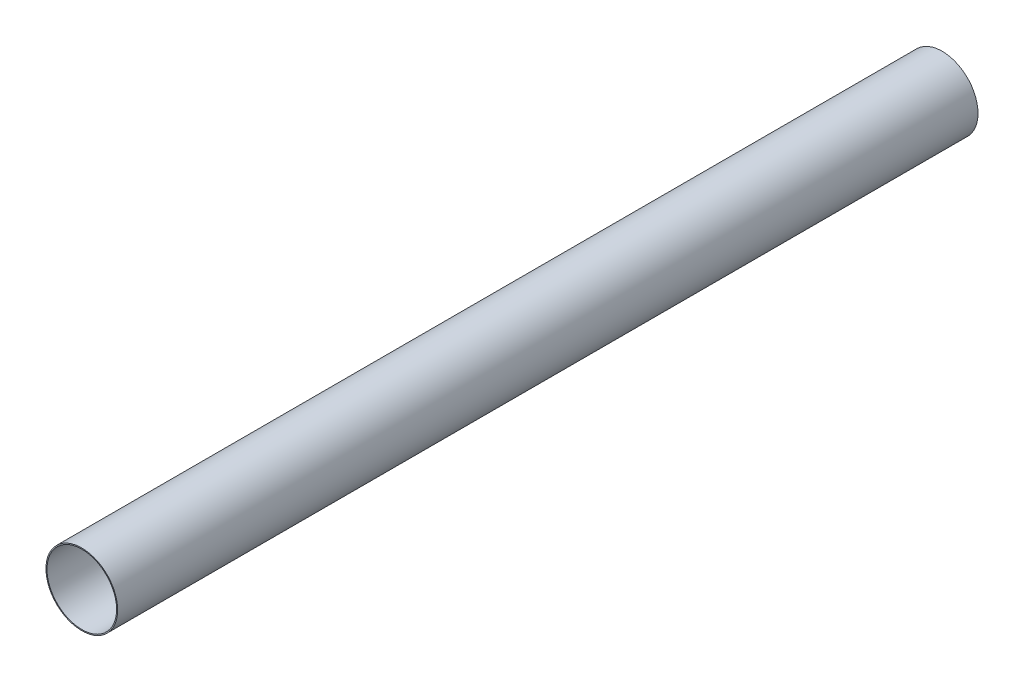
ISO-10303-21;
HEADER;
FILE_DESCRIPTION(('STEP AP214'),'2;1');
FILE_NAME('part.step','',(''),(''),'','','');
FILE_SCHEMA(('AUTOMOTIVE_DESIGN { 1 0 10303 214 1 1 1 1 }'));
ENDSEC;
DATA;
#1=APPLICATION_CONTEXT('core data for automotive mechanical design processes');
#2=APPLICATION_PROTOCOL_DEFINITION('international standard','automotive_design',2000,#1);
#3=PRODUCT_CONTEXT('',#1,'mechanical');
#4=PRODUCT('Part','Part','',(#3));
#5=PRODUCT_RELATED_PRODUCT_CATEGORY('part','',(#4));
#6=PRODUCT_DEFINITION_FORMATION('','',#4);
#7=PRODUCT_DEFINITION_CONTEXT('part definition',#1,'design');
#8=PRODUCT_DEFINITION('design','',#6,#7);
#9=PRODUCT_DEFINITION_SHAPE('','',#8);
#10=(LENGTH_UNIT() NAMED_UNIT(*) SI_UNIT(.MILLI.,.METRE.));
#11=(NAMED_UNIT(*) PLANE_ANGLE_UNIT() SI_UNIT($,.RADIAN.));
#12=(NAMED_UNIT(*) SI_UNIT($,.STERADIAN.) SOLID_ANGLE_UNIT());
#13=UNCERTAINTY_MEASURE_WITH_UNIT(LENGTH_MEASURE(1.E-05),#10,'distance_accuracy_value','');
#14=(GEOMETRIC_REPRESENTATION_CONTEXT(3) GLOBAL_UNCERTAINTY_ASSIGNED_CONTEXT((#13)) GLOBAL_UNIT_ASSIGNED_CONTEXT((#10,
#11,#12)) REPRESENTATION_CONTEXT('',''));
#15=CARTESIAN_POINT('',(0.,0.,0.));
#16=DIRECTION('',(0.,0.,1.));
#17=DIRECTION('',(1.,0.,0.));
#18=AXIS2_PLACEMENT_3D('',#15,#16,#17);
#19=CARTESIAN_POINT('',(0.,0.,1676.4));
#20=DIRECTION('',(0.,0.,1.));
#21=DIRECTION('',(1.,0.,0.));
#22=AXIS2_PLACEMENT_3D('',#19,#20,#21);
#23=PLANE('',#22);
#24=CARTESIAN_POINT('',(0.,0.,1676.4));
#25=DIRECTION('',(0.,0.,1.));
#26=DIRECTION('',(1.,0.,0.));
#27=AXIS2_PLACEMENT_3D('',#24,#25,#26);
#28=CIRCLE('',#27,69.85);
#29=CARTESIAN_POINT('',(69.85,0.,1676.4));
#30=VERTEX_POINT('',#29);
#31=EDGE_CURVE('E10',#30,#30,#28,.T.);
#32=ORIENTED_EDGE('',*,*,#31,.T.);
#33=EDGE_LOOP('',(#32));
#34=FACE_BOUND('',#33,.T.);
#35=CARTESIAN_POINT('',(0.,0.,1676.4));
#36=DIRECTION('',(0.,0.,1.));
#37=DIRECTION('',(1.,0.,0.));
#38=AXIS2_PLACEMENT_3D('',#35,#36,#37);
#39=CIRCLE('',#38,67.85);
#40=CARTESIAN_POINT('',(67.85,0.,1676.4));
#41=VERTEX_POINT('',#40);
#42=EDGE_CURVE('E46',#41,#41,#39,.T.);
#43=ORIENTED_EDGE('',*,*,#42,.F.);
#44=EDGE_LOOP('',(#43));
#45=FACE_BOUND('',#44,.T.);
#46=ADVANCED_FACE('F35',(#34,#45),#23,.T.);
#47=CARTESIAN_POINT('',(0.,0.,0.));
#48=DIRECTION('',(0.,0.,1.));
#49=DIRECTION('',(1.,0.,0.));
#50=AXIS2_PLACEMENT_3D('',#47,#48,#49);
#51=PLANE('',#50);
#52=CARTESIAN_POINT('',(0.,0.,0.));
#53=DIRECTION('',(0.,0.,1.));
#54=DIRECTION('',(1.,0.,0.));
#55=AXIS2_PLACEMENT_3D('',#52,#53,#54);
#56=CIRCLE('',#55,69.85);
#57=CARTESIAN_POINT('',(69.85,0.,0.));
#58=VERTEX_POINT('',#57);
#59=EDGE_CURVE('E39',#58,#58,#56,.T.);
#60=ORIENTED_EDGE('',*,*,#59,.F.);
#61=EDGE_LOOP('',(#60));
#62=FACE_BOUND('',#61,.T.);
#63=CARTESIAN_POINT('',(0.,0.,0.));
#64=DIRECTION('',(0.,0.,1.));
#65=DIRECTION('',(1.,0.,0.));
#66=AXIS2_PLACEMENT_3D('',#63,#64,#65);
#67=CIRCLE('',#66,67.85);
#68=CARTESIAN_POINT('',(67.85,0.,0.));
#69=VERTEX_POINT('',#68);
#70=EDGE_CURVE('E48',#69,#69,#67,.T.);
#71=ORIENTED_EDGE('',*,*,#70,.T.);
#72=EDGE_LOOP('',(#71));
#73=FACE_BOUND('',#72,.T.);
#74=ADVANCED_FACE('F58',(#62,#73),#51,.F.);
#75=CARTESIAN_POINT('',(0.,0.,1676.4));
#76=DIRECTION('',(0.,0.,-1.));
#77=DIRECTION('',(-1.,0.,0.));
#78=AXIS2_PLACEMENT_3D('',#75,#76,#77);
#79=CYLINDRICAL_SURFACE('',#78,69.85);
#80=ORIENTED_EDGE('',*,*,#31,.F.);
#81=EDGE_LOOP('',(#80));
#82=FACE_BOUND('',#81,.T.);
#83=ORIENTED_EDGE('',*,*,#59,.T.);
#84=EDGE_LOOP('',(#83));
#85=FACE_BOUND('',#84,.T.);
#86=ADVANCED_FACE('F37',(#82,#85),#79,.T.);
#87=CARTESIAN_POINT('',(0.,0.,1676.4));
#88=DIRECTION('',(0.,0.,-1.));
#89=DIRECTION('',(-1.,0.,0.));
#90=AXIS2_PLACEMENT_3D('',#87,#88,#89);
#91=CYLINDRICAL_SURFACE('',#90,67.85);
#92=ORIENTED_EDGE('',*,*,#42,.T.);
#93=EDGE_LOOP('',(#92));
#94=FACE_BOUND('',#93,.T.);
#95=ORIENTED_EDGE('',*,*,#70,.F.);
#96=EDGE_LOOP('',(#95));
#97=FACE_BOUND('',#96,.T.);
#98=ADVANCED_FACE('F54',(#94,#97),#91,.F.);
#99=CLOSED_SHELL('',(#46,#74,#86,#98));
#100=MANIFOLD_SOLID_BREP('B2',#99);
#101=ADVANCED_BREP_SHAPE_REPRESENTATION('',(#18,#100),#14);
#102=SHAPE_DEFINITION_REPRESENTATION(#9,#101);
ENDSEC;
END-ISO-10303-21;
